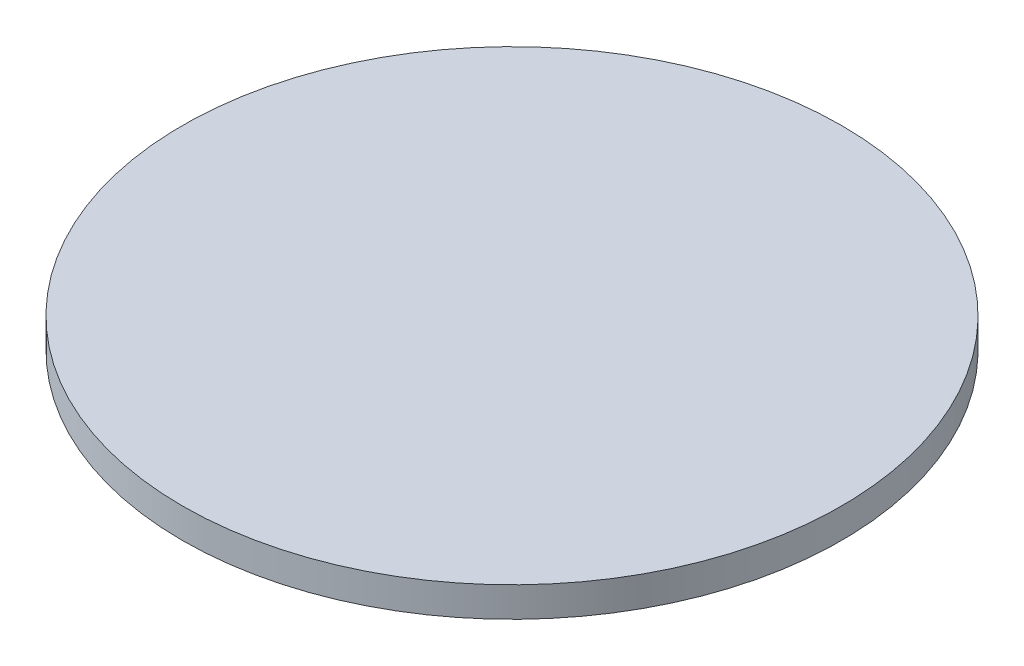
ISO-10303-21;
HEADER;
FILE_DESCRIPTION(('STEP AP214'),'2;1');
FILE_NAME('part.step','',(''),(''),'','','');
FILE_SCHEMA(('AUTOMOTIVE_DESIGN { 1 0 10303 214 1 1 1 1 }'));
ENDSEC;
DATA;
#1=APPLICATION_CONTEXT('core data for automotive mechanical design processes');
#2=APPLICATION_PROTOCOL_DEFINITION('international standard','automotive_design',2000,#1);
#3=PRODUCT_CONTEXT('',#1,'mechanical');
#4=PRODUCT('Part','Part','',(#3));
#5=PRODUCT_RELATED_PRODUCT_CATEGORY('part','',(#4));
#6=PRODUCT_DEFINITION_FORMATION('','',#4);
#7=PRODUCT_DEFINITION_CONTEXT('part definition',#1,'design');
#8=PRODUCT_DEFINITION('design','',#6,#7);
#9=PRODUCT_DEFINITION_SHAPE('','',#8);
#10=(LENGTH_UNIT() NAMED_UNIT(*) SI_UNIT(.MILLI.,.METRE.));
#11=(NAMED_UNIT(*) PLANE_ANGLE_UNIT() SI_UNIT($,.RADIAN.));
#12=(NAMED_UNIT(*) SI_UNIT($,.STERADIAN.) SOLID_ANGLE_UNIT());
#13=UNCERTAINTY_MEASURE_WITH_UNIT(LENGTH_MEASURE(1.E-05),#10,'distance_accuracy_value','');
#14=(GEOMETRIC_REPRESENTATION_CONTEXT(3) GLOBAL_UNCERTAINTY_ASSIGNED_CONTEXT((#13)) GLOBAL_UNIT_ASSIGNED_CONTEXT((#10,
#11,#12)) REPRESENTATION_CONTEXT('',''));
#15=CARTESIAN_POINT('',(0.,0.,0.));
#16=DIRECTION('',(0.,0.,1.));
#17=DIRECTION('',(1.,0.,0.));
#18=AXIS2_PLACEMENT_3D('',#15,#16,#17);
#19=CARTESIAN_POINT('',(0.,0.26662507,0.));
#20=DIRECTION('',(0.,-1.,0.));
#21=DIRECTION('',(0.,0.,-1.));
#22=AXIS2_PLACEMENT_3D('',#19,#20,#21);
#23=CYLINDRICAL_SURFACE('',#22,2.936875);
#24=CARTESIAN_POINT('',(0.,0.26662507,0.));
#25=DIRECTION('',(0.,1.,0.));
#26=DIRECTION('',(0.,0.,1.));
#27=AXIS2_PLACEMENT_3D('',#24,#25,#26);
#28=CIRCLE('',#27,2.936875);
#29=CARTESIAN_POINT('',(0.,0.26662507,2.936875));
#30=VERTEX_POINT('',#29);
#31=EDGE_CURVE('E10',#30,#30,#28,.T.);
#32=ORIENTED_EDGE('',*,*,#31,.F.);
#33=EDGE_LOOP('',(#32));
#34=FACE_BOUND('',#33,.T.);
#35=CARTESIAN_POINT('',(0.,0.,0.));
#36=DIRECTION('',(0.,1.,0.));
#37=DIRECTION('',(0.,0.,1.));
#38=AXIS2_PLACEMENT_3D('',#35,#36,#37);
#39=CIRCLE('',#38,2.936875);
#40=CARTESIAN_POINT('',(0.,0.,2.936875));
#41=VERTEX_POINT('',#40);
#42=EDGE_CURVE('E34',#41,#41,#39,.T.);
#43=ORIENTED_EDGE('',*,*,#42,.T.);
#44=EDGE_LOOP('',(#43));
#45=FACE_BOUND('',#44,.T.);
#46=ADVANCED_FACE('F31',(#34,#45),#23,.T.);
#47=CARTESIAN_POINT('',(0.,0.26662507,0.));
#48=DIRECTION('',(0.,1.,0.));
#49=DIRECTION('',(0.,0.,1.));
#50=AXIS2_PLACEMENT_3D('',#47,#48,#49);
#51=PLANE('',#50);
#52=ORIENTED_EDGE('',*,*,#31,.T.);
#53=EDGE_LOOP('',(#52));
#54=FACE_BOUND('',#53,.T.);
#55=ADVANCED_FACE('F46',(#54),#51,.T.);
#56=CARTESIAN_POINT('',(0.,0.,0.));
#57=DIRECTION('',(0.,1.,0.));
#58=DIRECTION('',(0.,0.,1.));
#59=AXIS2_PLACEMENT_3D('',#56,#57,#58);
#60=PLANE('',#59);
#61=ORIENTED_EDGE('',*,*,#42,.F.);
#62=EDGE_LOOP('',(#61));
#63=FACE_BOUND('',#62,.T.);
#64=ADVANCED_FACE('F44',(#63),#60,.F.);
#65=CLOSED_SHELL('',(#46,#55,#64));
#66=MANIFOLD_SOLID_BREP('B2',#65);
#67=ADVANCED_BREP_SHAPE_REPRESENTATION('',(#18,#66),#14);
#68=SHAPE_DEFINITION_REPRESENTATION(#9,#67);
ENDSEC;
END-ISO-10303-21;
